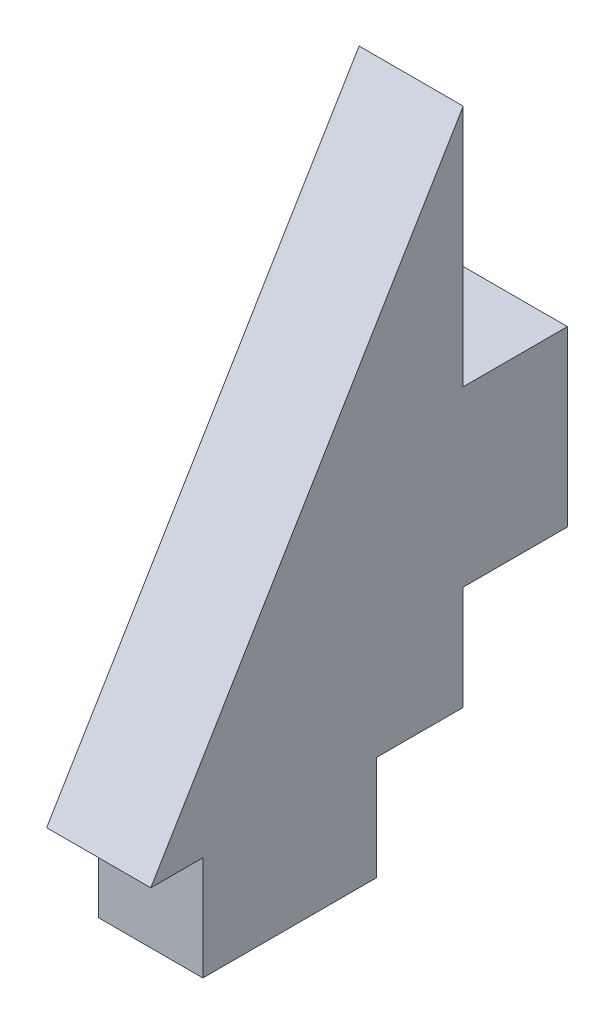
ISO-10303-21;
HEADER;
FILE_DESCRIPTION(('STEP AP214'),'2;1');
FILE_NAME('part.step','',(''),(''),'','','');
FILE_SCHEMA(('AUTOMOTIVE_DESIGN { 1 0 10303 214 1 1 1 1 }'));
ENDSEC;
DATA;
#1=APPLICATION_CONTEXT('core data for automotive mechanical design processes');
#2=APPLICATION_PROTOCOL_DEFINITION('international standard','automotive_design',2000,#1);
#3=PRODUCT_CONTEXT('',#1,'mechanical');
#4=PRODUCT('Part','Part','',(#3));
#5=PRODUCT_RELATED_PRODUCT_CATEGORY('part','',(#4));
#6=PRODUCT_DEFINITION_FORMATION('','',#4);
#7=PRODUCT_DEFINITION_CONTEXT('part definition',#1,'design');
#8=PRODUCT_DEFINITION('design','',#6,#7);
#9=PRODUCT_DEFINITION_SHAPE('','',#8);
#10=(LENGTH_UNIT() NAMED_UNIT(*) SI_UNIT(.MILLI.,.METRE.));
#11=(NAMED_UNIT(*) PLANE_ANGLE_UNIT() SI_UNIT($,.RADIAN.));
#12=(NAMED_UNIT(*) SI_UNIT($,.STERADIAN.) SOLID_ANGLE_UNIT());
#13=UNCERTAINTY_MEASURE_WITH_UNIT(LENGTH_MEASURE(1.E-05),#10,'distance_accuracy_value','');
#14=(GEOMETRIC_REPRESENTATION_CONTEXT(3) GLOBAL_UNCERTAINTY_ASSIGNED_CONTEXT((#13)) GLOBAL_UNIT_ASSIGNED_CONTEXT((#10,
#11,#12)) REPRESENTATION_CONTEXT('',''));
#15=CARTESIAN_POINT('',(0.,0.,0.));
#16=DIRECTION('',(0.,0.,1.));
#17=DIRECTION('',(1.,0.,0.));
#18=AXIS2_PLACEMENT_3D('',#15,#16,#17);
#19=CARTESIAN_POINT('',(3.,0.,0.));
#20=DIRECTION('',(0.,-1.,0.));
#21=DIRECTION('',(0.,0.,-1.));
#22=AXIS2_PLACEMENT_3D('',#19,#20,#21);
#23=PLANE('',#22);
#24=DIRECTION('',(0.,0.,1.));
#25=VECTOR('',#24,1.);
#26=CARTESIAN_POINT('',(0.,0.,0.));
#27=LINE('',#26,#25);
#28=CARTESIAN_POINT('',(0.,0.,0.));
#29=VERTEX_POINT('',#28);
#30=CARTESIAN_POINT('',(0.,0.,2.5));
#31=VERTEX_POINT('',#30);
#32=EDGE_CURVE('E147',#29,#31,#27,.T.);
#33=ORIENTED_EDGE('',*,*,#32,.F.);
#34=DIRECTION('',(-1.,0.,0.));
#35=VECTOR('',#34,1.);
#36=CARTESIAN_POINT('',(3.,0.,0.));
#37=LINE('',#36,#35);
#38=CARTESIAN_POINT('',(3.,0.,0.));
#39=VERTEX_POINT('',#38);
#40=EDGE_CURVE('E11',#39,#29,#37,.T.);
#41=ORIENTED_EDGE('',*,*,#40,.F.);
#42=DIRECTION('',(0.,0.,1.));
#43=VECTOR('',#42,1.);
#44=CARTESIAN_POINT('',(3.,0.,0.));
#45=LINE('',#44,#43);
#46=CARTESIAN_POINT('',(3.,0.,2.5));
#47=VERTEX_POINT('',#46);
#48=EDGE_CURVE('E171',#39,#47,#45,.T.);
#49=ORIENTED_EDGE('',*,*,#48,.T.);
#50=DIRECTION('',(-1.,0.,0.));
#51=VECTOR('',#50,1.);
#52=CARTESIAN_POINT('',(3.,0.,2.5));
#53=LINE('',#52,#51);
#54=EDGE_CURVE('E52',#47,#31,#53,.T.);
#55=ORIENTED_EDGE('',*,*,#54,.T.);
#56=EDGE_LOOP('',(#33,#41,#49,#55));
#57=FACE_BOUND('',#56,.T.);
#58=ADVANCED_FACE('F35',(#57),#23,.T.);
#59=CARTESIAN_POINT('',(3.,0.,0.));
#60=DIRECTION('',(0.,0.,-1.));
#61=DIRECTION('',(-1.,0.,0.));
#62=AXIS2_PLACEMENT_3D('',#59,#60,#61);
#63=PLANE('',#62);
#64=DIRECTION('',(0.,-1.,0.));
#65=VECTOR('',#64,1.);
#66=CARTESIAN_POINT('',(0.,0.,0.));
#67=LINE('',#66,#65);
#68=CARTESIAN_POINT('',(0.,3.,0.));
#69=VERTEX_POINT('',#68);
#70=EDGE_CURVE('E149',#69,#29,#67,.T.);
#71=ORIENTED_EDGE('',*,*,#70,.F.);
#72=DIRECTION('',(-1.,0.,0.));
#73=VECTOR('',#72,1.);
#74=CARTESIAN_POINT('',(3.,3.,0.));
#75=LINE('',#74,#73);
#76=CARTESIAN_POINT('',(3.,3.,0.));
#77=VERTEX_POINT('',#76);
#78=EDGE_CURVE('E44',#77,#69,#75,.T.);
#79=ORIENTED_EDGE('',*,*,#78,.F.);
#80=DIRECTION('',(0.,-1.,0.));
#81=VECTOR('',#80,1.);
#82=CARTESIAN_POINT('',(3.,0.,0.));
#83=LINE('',#82,#81);
#84=EDGE_CURVE('E198',#77,#39,#83,.T.);
#85=ORIENTED_EDGE('',*,*,#84,.T.);
#86=ORIENTED_EDGE('',*,*,#40,.T.);
#87=EDGE_LOOP('',(#71,#79,#85,#86));
#88=FACE_BOUND('',#87,.T.);
#89=ADVANCED_FACE('F197',(#88),#63,.T.);
#90=CARTESIAN_POINT('',(3.,3.,0.));
#91=DIRECTION('',(0.,1.,0.));
#92=DIRECTION('',(0.,0.,1.));
#93=AXIS2_PLACEMENT_3D('',#90,#91,#92);
#94=PLANE('',#93);
#95=DIRECTION('',(0.,0.,-1.));
#96=VECTOR('',#95,1.);
#97=CARTESIAN_POINT('',(0.,3.,0.));
#98=LINE('',#97,#96);
#99=CARTESIAN_POINT('',(0.,3.,-3.));
#100=VERTEX_POINT('',#99);
#101=EDGE_CURVE('E153',#69,#100,#98,.T.);
#102=ORIENTED_EDGE('',*,*,#101,.T.);
#103=DIRECTION('',(-1.,0.,0.));
#104=VECTOR('',#103,1.);
#105=CARTESIAN_POINT('',(3.,3.,-3.));
#106=LINE('',#105,#104);
#107=CARTESIAN_POINT('',(3.,3.,-3.));
#108=VERTEX_POINT('',#107);
#109=EDGE_CURVE('E183',#108,#100,#106,.T.);
#110=ORIENTED_EDGE('',*,*,#109,.F.);
#111=DIRECTION('',(0.,0.,-1.));
#112=VECTOR('',#111,1.);
#113=CARTESIAN_POINT('',(3.,3.,0.));
#114=LINE('',#113,#112);
#115=EDGE_CURVE('E189',#77,#108,#114,.T.);
#116=ORIENTED_EDGE('',*,*,#115,.F.);
#117=ORIENTED_EDGE('',*,*,#78,.T.);
#118=EDGE_LOOP('',(#102,#110,#116,#117));
#119=FACE_BOUND('',#118,.T.);
#120=ADVANCED_FACE('F37',(#119),#94,.F.);
#121=CARTESIAN_POINT('',(3.,0.,-3.));
#122=DIRECTION('',(0.,0.,1.));
#123=DIRECTION('',(0.,-1.,0.));
#124=AXIS2_PLACEMENT_3D('',#121,#122,#123);
#125=PLANE('',#124);
#126=DIRECTION('',(0.,1.,0.));
#127=VECTOR('',#126,1.);
#128=CARTESIAN_POINT('',(0.,0.,-3.));
#129=LINE('',#128,#127);
#130=CARTESIAN_POINT('',(0.,8.,-3.));
#131=VERTEX_POINT('',#130);
#132=EDGE_CURVE('E156',#100,#131,#129,.T.);
#133=ORIENTED_EDGE('',*,*,#132,.T.);
#134=DIRECTION('',(-1.,0.,0.));
#135=VECTOR('',#134,1.);
#136=CARTESIAN_POINT('',(3.,8.,-3.));
#137=LINE('',#136,#135);
#138=CARTESIAN_POINT('',(3.,8.,-3.));
#139=VERTEX_POINT('',#138);
#140=EDGE_CURVE('E181',#139,#131,#137,.T.);
#141=ORIENTED_EDGE('',*,*,#140,.F.);
#142=DIRECTION('',(0.,1.,0.));
#143=VECTOR('',#142,1.);
#144=CARTESIAN_POINT('',(3.,0.,-3.));
#145=LINE('',#144,#143);
#146=EDGE_CURVE('E248',#108,#139,#145,.T.);
#147=ORIENTED_EDGE('',*,*,#146,.F.);
#148=ORIENTED_EDGE('',*,*,#109,.T.);
#149=EDGE_LOOP('',(#133,#141,#147,#148));
#150=FACE_BOUND('',#149,.T.);
#151=ADVANCED_FACE('F247',(#150),#125,.F.);
#152=CARTESIAN_POINT('',(3.,8.,0.));
#153=DIRECTION('',(0.,1.,0.));
#154=DIRECTION('',(0.,0.,1.));
#155=AXIS2_PLACEMENT_3D('',#152,#153,#154);
#156=PLANE('',#155);
#157=DIRECTION('',(0.,0.,-1.));
#158=VECTOR('',#157,1.);
#159=CARTESIAN_POINT('',(0.,8.,0.));
#160=LINE('',#159,#158);
#161=CARTESIAN_POINT('',(0.,8.,0.));
#162=VERTEX_POINT('',#161);
#163=EDGE_CURVE('E159',#162,#131,#160,.T.);
#164=ORIENTED_EDGE('',*,*,#163,.F.);
#165=DIRECTION('',(-1.,0.,0.));
#166=VECTOR('',#165,1.);
#167=CARTESIAN_POINT('',(3.,8.,0.));
#168=LINE('',#167,#166);
#169=CARTESIAN_POINT('',(3.,8.,0.));
#170=VERTEX_POINT('',#169);
#171=EDGE_CURVE('E179',#170,#162,#168,.T.);
#172=ORIENTED_EDGE('',*,*,#171,.F.);
#173=DIRECTION('',(0.,0.,-1.));
#174=VECTOR('',#173,1.);
#175=CARTESIAN_POINT('',(3.,8.,0.));
#176=LINE('',#175,#174);
#177=EDGE_CURVE('E244',#170,#139,#176,.T.);
#178=ORIENTED_EDGE('',*,*,#177,.T.);
#179=ORIENTED_EDGE('',*,*,#140,.T.);
#180=EDGE_LOOP('',(#164,#172,#178,#179));
#181=FACE_BOUND('',#180,.T.);
#182=ADVANCED_FACE('F242',(#181),#156,.T.);
#183=CARTESIAN_POINT('',(0.,15.,0.));
#184=VERTEX_POINT('',#183);
#185=EDGE_CURVE('E154',#184,#162,#67,.T.);
#186=ORIENTED_EDGE('',*,*,#185,.F.);
#187=DIRECTION('',(-1.,0.,0.));
#188=VECTOR('',#187,1.);
#189=CARTESIAN_POINT('',(3.,15.,0.));
#190=LINE('',#189,#188);
#191=CARTESIAN_POINT('',(3.,15.,0.));
#192=VERTEX_POINT('',#191);
#193=EDGE_CURVE('E177',#192,#184,#190,.T.);
#194=ORIENTED_EDGE('',*,*,#193,.F.);
#195=EDGE_CURVE('E238',#192,#170,#83,.T.);
#196=ORIENTED_EDGE('',*,*,#195,.T.);
#197=ORIENTED_EDGE('',*,*,#171,.T.);
#198=EDGE_LOOP('',(#186,#194,#196,#197));
#199=FACE_BOUND('',#198,.T.);
#200=ADVANCED_FACE('F216',(#199),#63,.T.);
#201=CARTESIAN_POINT('',(3.,3.97058823529412,6.61764705882353));
#202=DIRECTION('',(0.,0.514495755427527,0.857492925712544));
#203=DIRECTION('',(0.,-0.857492925712544,0.514495755427527));
#204=AXIS2_PLACEMENT_3D('',#201,#202,#203);
#205=PLANE('',#204);
#206=DIRECTION('',(0.,0.857492925712544,-0.514495755427526));
#207=VECTOR('',#206,1.);
#208=CARTESIAN_POINT('',(0.,3.97058823529412,6.61764705882353));
#209=LINE('',#208,#207);
#210=CARTESIAN_POINT('',(0.,0.,9.));
#211=VERTEX_POINT('',#210);
#212=EDGE_CURVE('E162',#211,#184,#209,.T.);
#213=ORIENTED_EDGE('',*,*,#212,.F.);
#214=DIRECTION('',(-1.,0.,0.));
#215=VECTOR('',#214,1.);
#216=CARTESIAN_POINT('',(3.,0.,9.));
#217=LINE('',#216,#215);
#218=CARTESIAN_POINT('',(3.,0.,9.));
#219=VERTEX_POINT('',#218);
#220=EDGE_CURVE('E175',#219,#211,#217,.T.);
#221=ORIENTED_EDGE('',*,*,#220,.F.);
#222=DIRECTION('',(0.,0.857492925712544,-0.514495755427526));
#223=VECTOR('',#222,1.);
#224=CARTESIAN_POINT('',(3.,3.97058823529412,6.61764705882353));
#225=LINE('',#224,#223);
#226=EDGE_CURVE('E233',#219,#192,#225,.T.);
#227=ORIENTED_EDGE('',*,*,#226,.T.);
#228=ORIENTED_EDGE('',*,*,#193,.T.);
#229=EDGE_LOOP('',(#213,#221,#227,#228));
#230=FACE_BOUND('',#229,.T.);
#231=ADVANCED_FACE('F220',(#230),#205,.T.);
#232=CARTESIAN_POINT('',(0.,0.,7.5));
#233=VERTEX_POINT('',#232);
#234=EDGE_CURVE('E150',#233,#211,#27,.T.);
#235=ORIENTED_EDGE('',*,*,#234,.F.);
#236=DIRECTION('',(-1.,0.,0.));
#237=VECTOR('',#236,1.);
#238=CARTESIAN_POINT('',(3.,0.,7.5));
#239=LINE('',#238,#237);
#240=CARTESIAN_POINT('',(3.,0.,7.5));
#241=VERTEX_POINT('',#240);
#242=EDGE_CURVE('E139',#241,#233,#239,.T.);
#243=ORIENTED_EDGE('',*,*,#242,.F.);
#244=EDGE_CURVE('E129',#241,#219,#45,.T.);
#245=ORIENTED_EDGE('',*,*,#244,.T.);
#246=ORIENTED_EDGE('',*,*,#220,.T.);
#247=EDGE_LOOP('',(#235,#243,#245,#246));
#248=FACE_BOUND('',#247,.T.);
#249=ADVANCED_FACE('F211',(#248),#23,.T.);
#250=CARTESIAN_POINT('',(3.,0.,7.5));
#251=DIRECTION('',(0.,0.,-1.));
#252=DIRECTION('',(-1.,0.,0.));
#253=AXIS2_PLACEMENT_3D('',#250,#251,#252);
#254=PLANE('',#253);
#255=DIRECTION('',(0.,-1.,0.));
#256=VECTOR('',#255,1.);
#257=CARTESIAN_POINT('',(0.,0.,7.5));
#258=LINE('',#257,#256);
#259=CARTESIAN_POINT('',(0.,-3.,7.5));
#260=VERTEX_POINT('',#259);
#261=EDGE_CURVE('E136',#233,#260,#258,.T.);
#262=ORIENTED_EDGE('',*,*,#261,.T.);
#263=DIRECTION('',(-1.,0.,0.));
#264=VECTOR('',#263,1.);
#265=CARTESIAN_POINT('',(3.,-3.,7.5));
#266=LINE('',#265,#264);
#267=CARTESIAN_POINT('',(3.,-3.,7.5));
#268=VERTEX_POINT('',#267);
#269=EDGE_CURVE('E133',#268,#260,#266,.T.);
#270=ORIENTED_EDGE('',*,*,#269,.F.);
#271=DIRECTION('',(0.,-1.,0.));
#272=VECTOR('',#271,1.);
#273=CARTESIAN_POINT('',(3.,0.,7.5));
#274=LINE('',#273,#272);
#275=EDGE_CURVE('E121',#241,#268,#274,.T.);
#276=ORIENTED_EDGE('',*,*,#275,.F.);
#277=ORIENTED_EDGE('',*,*,#242,.T.);
#278=EDGE_LOOP('',(#262,#270,#276,#277));
#279=FACE_BOUND('',#278,.T.);
#280=ADVANCED_FACE('F134',(#279),#254,.F.);
#281=CARTESIAN_POINT('',(3.,-3.,0.));
#282=DIRECTION('',(0.,1.,0.));
#283=DIRECTION('',(0.,0.,1.));
#284=AXIS2_PLACEMENT_3D('',#281,#282,#283);
#285=PLANE('',#284);
#286=DIRECTION('',(0.,0.,-1.));
#287=VECTOR('',#286,1.);
#288=CARTESIAN_POINT('',(0.,-3.,0.));
#289=LINE('',#288,#287);
#290=CARTESIAN_POINT('',(0.,-3.,2.5));
#291=VERTEX_POINT('',#290);
#292=EDGE_CURVE('E166',#260,#291,#289,.T.);
#293=ORIENTED_EDGE('',*,*,#292,.T.);
#294=DIRECTION('',(-1.,0.,0.));
#295=VECTOR('',#294,1.);
#296=CARTESIAN_POINT('',(3.,-3.,2.5));
#297=LINE('',#296,#295);
#298=CARTESIAN_POINT('',(3.,-3.,2.5));
#299=VERTEX_POINT('',#298);
#300=EDGE_CURVE('E87',#299,#291,#297,.T.);
#301=ORIENTED_EDGE('',*,*,#300,.F.);
#302=DIRECTION('',(0.,0.,-1.));
#303=VECTOR('',#302,1.);
#304=CARTESIAN_POINT('',(3.,-3.,0.));
#305=LINE('',#304,#303);
#306=EDGE_CURVE('E126',#268,#299,#305,.T.);
#307=ORIENTED_EDGE('',*,*,#306,.F.);
#308=ORIENTED_EDGE('',*,*,#269,.T.);
#309=EDGE_LOOP('',(#293,#301,#307,#308));
#310=FACE_BOUND('',#309,.T.);
#311=ADVANCED_FACE('F141',(#310),#285,.F.);
#312=CARTESIAN_POINT('',(3.,0.,2.5));
#313=DIRECTION('',(0.,0.,-1.));
#314=DIRECTION('',(0.,1.,0.));
#315=AXIS2_PLACEMENT_3D('',#312,#313,#314);
#316=PLANE('',#315);
#317=DIRECTION('',(0.,-1.,0.));
#318=VECTOR('',#317,1.);
#319=CARTESIAN_POINT('',(0.,0.,2.5));
#320=LINE('',#319,#318);
#321=EDGE_CURVE('E168',#31,#291,#320,.T.);
#322=ORIENTED_EDGE('',*,*,#321,.F.);
#323=ORIENTED_EDGE('',*,*,#54,.F.);
#324=DIRECTION('',(0.,-1.,0.));
#325=VECTOR('',#324,1.);
#326=CARTESIAN_POINT('',(3.,0.,2.5));
#327=LINE('',#326,#325);
#328=EDGE_CURVE('E142',#47,#299,#327,.T.);
#329=ORIENTED_EDGE('',*,*,#328,.T.);
#330=ORIENTED_EDGE('',*,*,#300,.T.);
#331=EDGE_LOOP('',(#322,#323,#329,#330));
#332=FACE_BOUND('',#331,.T.);
#333=ADVANCED_FACE('F199',(#332),#316,.T.);
#334=CARTESIAN_POINT('',(3.,0.,0.));
#335=DIRECTION('',(1.,0.,0.));
#336=DIRECTION('',(0.,0.,-1.));
#337=AXIS2_PLACEMENT_3D('',#334,#335,#336);
#338=PLANE('',#337);
#339=ORIENTED_EDGE('',*,*,#48,.F.);
#340=ORIENTED_EDGE('',*,*,#84,.F.);
#341=ORIENTED_EDGE('',*,*,#115,.T.);
#342=ORIENTED_EDGE('',*,*,#146,.T.);
#343=ORIENTED_EDGE('',*,*,#177,.F.);
#344=ORIENTED_EDGE('',*,*,#195,.F.);
#345=ORIENTED_EDGE('',*,*,#226,.F.);
#346=ORIENTED_EDGE('',*,*,#244,.F.);
#347=ORIENTED_EDGE('',*,*,#275,.T.);
#348=ORIENTED_EDGE('',*,*,#306,.T.);
#349=ORIENTED_EDGE('',*,*,#328,.F.);
#350=EDGE_LOOP('',(#339,#340,#341,#342,#343,#344,#345,#346,#347,#348,#349));
#351=FACE_BOUND('',#350,.T.);
#352=ADVANCED_FACE('F123',(#351),#338,.T.);
#353=CARTESIAN_POINT('',(0.,0.,0.));
#354=DIRECTION('',(1.,0.,0.));
#355=DIRECTION('',(0.,0.,-1.));
#356=AXIS2_PLACEMENT_3D('',#353,#354,#355);
#357=PLANE('',#356);
#358=ORIENTED_EDGE('',*,*,#32,.T.);
#359=ORIENTED_EDGE('',*,*,#321,.T.);
#360=ORIENTED_EDGE('',*,*,#292,.F.);
#361=ORIENTED_EDGE('',*,*,#261,.F.);
#362=ORIENTED_EDGE('',*,*,#234,.T.);
#363=ORIENTED_EDGE('',*,*,#212,.T.);
#364=ORIENTED_EDGE('',*,*,#185,.T.);
#365=ORIENTED_EDGE('',*,*,#163,.T.);
#366=ORIENTED_EDGE('',*,*,#132,.F.);
#367=ORIENTED_EDGE('',*,*,#101,.F.);
#368=ORIENTED_EDGE('',*,*,#70,.T.);
#369=EDGE_LOOP('',(#358,#359,#360,#361,#362,#363,#364,#365,#366,#367,#368));
#370=FACE_BOUND('',#369,.T.);
#371=ADVANCED_FACE('F196',(#370),#357,.F.);
#372=CLOSED_SHELL('',(#58,#89,#120,#151,#182,#200,#231,#249,#280,#311,#333,#352,#371));
#373=MANIFOLD_SOLID_BREP('B2',#372);
#374=ADVANCED_BREP_SHAPE_REPRESENTATION('',(#18,#373),#14);
#375=SHAPE_DEFINITION_REPRESENTATION(#9,#374);
ENDSEC;
END-ISO-10303-21;
